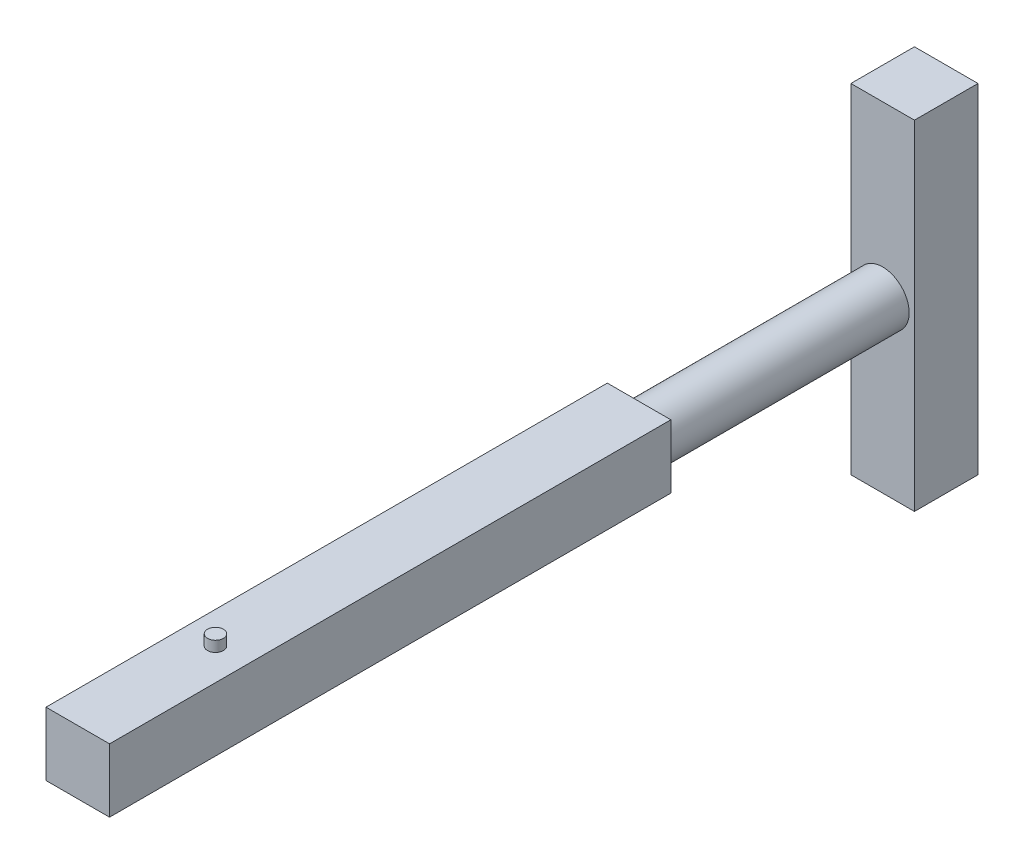
ISO-10303-21;
HEADER;
FILE_DESCRIPTION(('STEP AP214'),'2;1');
FILE_NAME('part.step','',(''),(''),'','','');
FILE_SCHEMA(('AUTOMOTIVE_DESIGN { 1 0 10303 214 1 1 1 1 }'));
ENDSEC;
DATA;
#1=APPLICATION_CONTEXT('core data for automotive mechanical design processes');
#2=APPLICATION_PROTOCOL_DEFINITION('international standard','automotive_design',2000,#1);
#3=PRODUCT_CONTEXT('',#1,'mechanical');
#4=PRODUCT('Part','Part','',(#3));
#5=PRODUCT_RELATED_PRODUCT_CATEGORY('part','',(#4));
#6=PRODUCT_DEFINITION_FORMATION('','',#4);
#7=PRODUCT_DEFINITION_CONTEXT('part definition',#1,'design');
#8=PRODUCT_DEFINITION('design','',#6,#7);
#9=PRODUCT_DEFINITION_SHAPE('','',#8);
#10=(LENGTH_UNIT() NAMED_UNIT(*) SI_UNIT(.MILLI.,.METRE.));
#11=(NAMED_UNIT(*) PLANE_ANGLE_UNIT() SI_UNIT($,.RADIAN.));
#12=(NAMED_UNIT(*) SI_UNIT($,.STERADIAN.) SOLID_ANGLE_UNIT());
#13=UNCERTAINTY_MEASURE_WITH_UNIT(LENGTH_MEASURE(1.E-05),#10,'distance_accuracy_value','');
#14=(GEOMETRIC_REPRESENTATION_CONTEXT(3) GLOBAL_UNCERTAINTY_ASSIGNED_CONTEXT((#13)) GLOBAL_UNIT_ASSIGNED_CONTEXT((#10,
#11,#12)) REPRESENTATION_CONTEXT('',''));
#15=CARTESIAN_POINT('',(0.,0.,0.));
#16=DIRECTION('',(0.,0.,1.));
#17=DIRECTION('',(1.,0.,0.));
#18=AXIS2_PLACEMENT_3D('',#15,#16,#17);
#19=CARTESIAN_POINT('',(30.,30.,530.));
#20=DIRECTION('',(-1.,0.,0.));
#21=DIRECTION('',(0.,-1.,0.));
#22=AXIS2_PLACEMENT_3D('',#19,#20,#21);
#23=PLANE('',#22);
#24=DIRECTION('',(0.,1.,0.));
#25=VECTOR('',#24,1.);
#26=CARTESIAN_POINT('',(30.,30.,0.));
#27=LINE('',#26,#25);
#28=CARTESIAN_POINT('',(30.,-30.,0.));
#29=VERTEX_POINT('',#28);
#30=CARTESIAN_POINT('',(30.,30.,0.));
#31=VERTEX_POINT('',#30);
#32=EDGE_CURVE('E153',#29,#31,#27,.T.);
#33=ORIENTED_EDGE('',*,*,#32,.T.);
#34=DIRECTION('',(0.,0.,-1.));
#35=VECTOR('',#34,1.);
#36=CARTESIAN_POINT('',(30.,30.,530.));
#37=LINE('',#36,#35);
#38=CARTESIAN_POINT('',(30.,30.,530.));
#39=VERTEX_POINT('',#38);
#40=EDGE_CURVE('E157',#39,#31,#37,.T.);
#41=ORIENTED_EDGE('',*,*,#40,.F.);
#42=DIRECTION('',(0.,1.,0.));
#43=VECTOR('',#42,1.);
#44=CARTESIAN_POINT('',(30.,30.,530.));
#45=LINE('',#44,#43);
#46=CARTESIAN_POINT('',(30.,-30.,530.));
#47=VERTEX_POINT('',#46);
#48=EDGE_CURVE('E158',#47,#39,#45,.T.);
#49=ORIENTED_EDGE('',*,*,#48,.F.);
#50=DIRECTION('',(0.,0.,-1.));
#51=VECTOR('',#50,1.);
#52=CARTESIAN_POINT('',(30.,-30.,530.));
#53=LINE('',#52,#51);
#54=EDGE_CURVE('E164',#47,#29,#53,.T.);
#55=ORIENTED_EDGE('',*,*,#54,.T.);
#56=EDGE_LOOP('',(#33,#41,#49,#55));
#57=FACE_BOUND('',#56,.T.);
#58=ADVANCED_FACE('F39',(#57),#23,.F.);
#59=CARTESIAN_POINT('',(-30.,30.,530.));
#60=DIRECTION('',(0.,-1.,0.));
#61=DIRECTION('',(0.,0.,-1.));
#62=AXIS2_PLACEMENT_3D('',#59,#60,#61);
#63=PLANE('',#62);
#64=CARTESIAN_POINT('',(0.,30.,400.));
#65=DIRECTION('',(0.,-1.,0.));
#66=DIRECTION('',(0.,0.,-1.));
#67=AXIS2_PLACEMENT_3D('',#64,#65,#66);
#68=CIRCLE('',#67,7.5);
#69=CARTESIAN_POINT('',(0.,30.,392.5));
#70=VERTEX_POINT('',#69);
#71=EDGE_CURVE('E47',#70,#70,#68,.F.);
#72=ORIENTED_EDGE('',*,*,#71,.F.);
#73=EDGE_LOOP('',(#72));
#74=FACE_BOUND('',#73,.T.);
#75=DIRECTION('',(-1.,0.,0.));
#76=VECTOR('',#75,1.);
#77=CARTESIAN_POINT('',(-30.,30.,0.));
#78=LINE('',#77,#76);
#79=CARTESIAN_POINT('',(-30.,30.,0.));
#80=VERTEX_POINT('',#79);
#81=EDGE_CURVE('E167',#31,#80,#78,.T.);
#82=ORIENTED_EDGE('',*,*,#81,.T.);
#83=DIRECTION('',(0.,0.,-1.));
#84=VECTOR('',#83,1.);
#85=CARTESIAN_POINT('',(-30.,30.,530.));
#86=LINE('',#85,#84);
#87=CARTESIAN_POINT('',(-30.,30.,530.));
#88=VERTEX_POINT('',#87);
#89=EDGE_CURVE('E174',#88,#80,#86,.T.);
#90=ORIENTED_EDGE('',*,*,#89,.F.);
#91=DIRECTION('',(-1.,0.,0.));
#92=VECTOR('',#91,1.);
#93=CARTESIAN_POINT('',(-30.,30.,530.));
#94=LINE('',#93,#92);
#95=EDGE_CURVE('E87',#39,#88,#94,.T.);
#96=ORIENTED_EDGE('',*,*,#95,.F.);
#97=ORIENTED_EDGE('',*,*,#40,.T.);
#98=EDGE_LOOP('',(#82,#90,#96,#97));
#99=FACE_BOUND('',#98,.T.);
#100=ADVANCED_FACE('F181',(#74,#99),#63,.F.);
#101=CARTESIAN_POINT('',(-30.,30.,530.));
#102=DIRECTION('',(1.,0.,0.));
#103=DIRECTION('',(0.,1.,0.));
#104=AXIS2_PLACEMENT_3D('',#101,#102,#103);
#105=PLANE('',#104);
#106=DIRECTION('',(0.,-1.,0.));
#107=VECTOR('',#106,1.);
#108=CARTESIAN_POINT('',(-30.,30.,0.));
#109=LINE('',#108,#107);
#110=CARTESIAN_POINT('',(-30.,-30.,0.));
#111=VERTEX_POINT('',#110);
#112=EDGE_CURVE('E73',#80,#111,#109,.T.);
#113=ORIENTED_EDGE('',*,*,#112,.T.);
#114=DIRECTION('',(0.,0.,-1.));
#115=VECTOR('',#114,1.);
#116=CARTESIAN_POINT('',(-30.,-30.,530.));
#117=LINE('',#116,#115);
#118=CARTESIAN_POINT('',(-30.,-30.,530.));
#119=VERTEX_POINT('',#118);
#120=EDGE_CURVE('E172',#119,#111,#117,.T.);
#121=ORIENTED_EDGE('',*,*,#120,.F.);
#122=DIRECTION('',(0.,-1.,0.));
#123=VECTOR('',#122,1.);
#124=CARTESIAN_POINT('',(-30.,30.,530.));
#125=LINE('',#124,#123);
#126=EDGE_CURVE('E161',#88,#119,#125,.T.);
#127=ORIENTED_EDGE('',*,*,#126,.F.);
#128=ORIENTED_EDGE('',*,*,#89,.T.);
#129=EDGE_LOOP('',(#113,#121,#127,#128));
#130=FACE_BOUND('',#129,.T.);
#131=ADVANCED_FACE('F183',(#130),#105,.F.);
#132=CARTESIAN_POINT('',(-30.,-30.,530.));
#133=DIRECTION('',(0.,1.,0.));
#134=DIRECTION('',(0.,0.,1.));
#135=AXIS2_PLACEMENT_3D('',#132,#133,#134);
#136=PLANE('',#135);
#137=CARTESIAN_POINT('',(0.,-30.,400.));
#138=DIRECTION('',(0.,1.,0.));
#139=DIRECTION('',(0.,0.,1.));
#140=AXIS2_PLACEMENT_3D('',#137,#138,#139);
#141=CIRCLE('',#140,7.5);
#142=CARTESIAN_POINT('',(0.,-30.,407.5));
#143=VERTEX_POINT('',#142);
#144=EDGE_CURVE('E11',#143,#143,#141,.F.);
#145=ORIENTED_EDGE('',*,*,#144,.F.);
#146=EDGE_LOOP('',(#145));
#147=FACE_BOUND('',#146,.T.);
#148=DIRECTION('',(1.,0.,0.));
#149=VECTOR('',#148,1.);
#150=CARTESIAN_POINT('',(-30.,-30.,0.));
#151=LINE('',#150,#149);
#152=EDGE_CURVE('E79',#111,#29,#151,.T.);
#153=ORIENTED_EDGE('',*,*,#152,.T.);
#154=ORIENTED_EDGE('',*,*,#54,.F.);
#155=DIRECTION('',(1.,0.,0.));
#156=VECTOR('',#155,1.);
#157=CARTESIAN_POINT('',(-30.,-30.,530.));
#158=LINE('',#157,#156);
#159=EDGE_CURVE('E55',#119,#47,#158,.T.);
#160=ORIENTED_EDGE('',*,*,#159,.F.);
#161=ORIENTED_EDGE('',*,*,#120,.T.);
#162=EDGE_LOOP('',(#153,#154,#160,#161));
#163=FACE_BOUND('',#162,.T.);
#164=ADVANCED_FACE('F191',(#147,#163),#136,.F.);
#165=CARTESIAN_POINT('',(0.,0.,530.));
#166=DIRECTION('',(0.,0.,1.));
#167=DIRECTION('',(1.,0.,0.));
#168=AXIS2_PLACEMENT_3D('',#165,#166,#167);
#169=PLANE('',#168);
#170=ORIENTED_EDGE('',*,*,#48,.T.);
#171=ORIENTED_EDGE('',*,*,#95,.T.);
#172=ORIENTED_EDGE('',*,*,#126,.T.);
#173=ORIENTED_EDGE('',*,*,#159,.T.);
#174=EDGE_LOOP('',(#170,#171,#172,#173));
#175=FACE_BOUND('',#174,.T.);
#176=ADVANCED_FACE('F193',(#175),#169,.T.);
#177=CARTESIAN_POINT('',(0.,0.,0.));
#178=DIRECTION('',(0.,0.,1.));
#179=DIRECTION('',(1.,0.,0.));
#180=AXIS2_PLACEMENT_3D('',#177,#178,#179);
#181=PLANE('',#180);
#182=CARTESIAN_POINT('',(0.,0.,0.));
#183=DIRECTION('',(0.,0.,-1.));
#184=DIRECTION('',(-1.,0.,0.));
#185=AXIS2_PLACEMENT_3D('',#182,#183,#184);
#186=CIRCLE('',#185,25.);
#187=CARTESIAN_POINT('',(-25.,0.,0.));
#188=VERTEX_POINT('',#187);
#189=EDGE_CURVE('E154',#188,#188,#186,.T.);
#190=ORIENTED_EDGE('',*,*,#189,.F.);
#191=EDGE_LOOP('',(#190));
#192=FACE_BOUND('',#191,.T.);
#193=ORIENTED_EDGE('',*,*,#32,.F.);
#194=ORIENTED_EDGE('',*,*,#152,.F.);
#195=ORIENTED_EDGE('',*,*,#112,.F.);
#196=ORIENTED_EDGE('',*,*,#81,.F.);
#197=EDGE_LOOP('',(#193,#194,#195,#196));
#198=FACE_BOUND('',#197,.T.);
#199=ADVANCED_FACE('F188',(#192,#198),#181,.F.);
#200=CARTESIAN_POINT('',(0.,0.,-230.));
#201=DIRECTION('',(0.,0.,1.));
#202=DIRECTION('',(1.,0.,0.));
#203=AXIS2_PLACEMENT_3D('',#200,#201,#202);
#204=CYLINDRICAL_SURFACE('',#203,25.);
#205=CARTESIAN_POINT('',(0.,0.,-230.));
#206=DIRECTION('',(0.,0.,-1.));
#207=DIRECTION('',(-1.,0.,0.));
#208=AXIS2_PLACEMENT_3D('',#205,#206,#207);
#209=CIRCLE('',#208,25.);
#210=CARTESIAN_POINT('',(-25.,0.,-230.));
#211=VERTEX_POINT('',#210);
#212=EDGE_CURVE('E150',#211,#211,#209,.T.);
#213=ORIENTED_EDGE('',*,*,#212,.F.);
#214=EDGE_LOOP('',(#213));
#215=FACE_BOUND('',#214,.T.);
#216=ORIENTED_EDGE('',*,*,#189,.T.);
#217=EDGE_LOOP('',(#216));
#218=FACE_BOUND('',#217,.T.);
#219=ADVANCED_FACE('F234',(#215,#218),#204,.T.);
#220=CARTESIAN_POINT('',(0.,40.,400.));
#221=DIRECTION('',(0.,-1.,0.));
#222=DIRECTION('',(0.,0.,-1.));
#223=AXIS2_PLACEMENT_3D('',#220,#221,#222);
#224=CYLINDRICAL_SURFACE('',#223,7.5);
#225=CARTESIAN_POINT('',(0.,40.,400.));
#226=DIRECTION('',(0.,1.,0.));
#227=DIRECTION('',(0.,0.,1.));
#228=AXIS2_PLACEMENT_3D('',#225,#226,#227);
#229=CIRCLE('',#228,7.5);
#230=CARTESIAN_POINT('',(0.,40.,407.5));
#231=VERTEX_POINT('',#230);
#232=EDGE_CURVE('E142',#231,#231,#229,.T.);
#233=ORIENTED_EDGE('',*,*,#232,.F.);
#234=EDGE_LOOP('',(#233));
#235=FACE_BOUND('',#234,.T.);
#236=ORIENTED_EDGE('',*,*,#71,.T.);
#237=EDGE_LOOP('',(#236));
#238=FACE_BOUND('',#237,.T.);
#239=ADVANCED_FACE('F179',(#235,#238),#224,.T.);
#240=CARTESIAN_POINT('',(0.,40.,400.));
#241=DIRECTION('',(0.,1.,0.));
#242=DIRECTION('',(0.,0.,1.));
#243=AXIS2_PLACEMENT_3D('',#240,#241,#242);
#244=PLANE('',#243);
#245=ORIENTED_EDGE('',*,*,#232,.T.);
#246=EDGE_LOOP('',(#245));
#247=FACE_BOUND('',#246,.T.);
#248=ADVANCED_FACE('F253',(#247),#244,.T.);
#249=CARTESIAN_POINT('',(0.,-40.,400.));
#250=DIRECTION('',(0.,1.,0.));
#251=DIRECTION('',(0.,0.,1.));
#252=AXIS2_PLACEMENT_3D('',#249,#250,#251);
#253=CYLINDRICAL_SURFACE('',#252,7.5);
#254=CARTESIAN_POINT('',(0.,-40.,400.));
#255=DIRECTION('',(0.,-1.,0.));
#256=DIRECTION('',(0.,0.,-1.));
#257=AXIS2_PLACEMENT_3D('',#254,#255,#256);
#258=CIRCLE('',#257,7.5);
#259=CARTESIAN_POINT('',(0.,-40.,392.5));
#260=VERTEX_POINT('',#259);
#261=EDGE_CURVE('E139',#260,#260,#258,.T.);
#262=ORIENTED_EDGE('',*,*,#261,.F.);
#263=EDGE_LOOP('',(#262));
#264=FACE_BOUND('',#263,.T.);
#265=ORIENTED_EDGE('',*,*,#144,.T.);
#266=EDGE_LOOP('',(#265));
#267=FACE_BOUND('',#266,.T.);
#268=ADVANCED_FACE('F260',(#264,#267),#253,.T.);
#269=CARTESIAN_POINT('',(0.,-40.,400.));
#270=DIRECTION('',(0.,-1.,0.));
#271=DIRECTION('',(0.,0.,-1.));
#272=AXIS2_PLACEMENT_3D('',#269,#270,#271);
#273=PLANE('',#272);
#274=ORIENTED_EDGE('',*,*,#261,.T.);
#275=EDGE_LOOP('',(#274));
#276=FACE_BOUND('',#275,.T.);
#277=ADVANCED_FACE('F268',(#276),#273,.T.);
#278=CARTESIAN_POINT('',(30.0000000000006,160.,-290.));
#279=DIRECTION('',(0.,-1.,0.));
#280=DIRECTION('',(1.,0.,0.));
#281=AXIS2_PLACEMENT_3D('',#278,#279,#280);
#282=PLANE('',#281);
#283=DIRECTION('',(1.,0.,0.));
#284=VECTOR('',#283,1.);
#285=CARTESIAN_POINT('',(30.0000000000006,160.,-230.));
#286=LINE('',#285,#284);
#287=CARTESIAN_POINT('',(-29.9999999999994,160.,-230.));
#288=VERTEX_POINT('',#287);
#289=CARTESIAN_POINT('',(30.0000000000006,160.,-230.));
#290=VERTEX_POINT('',#289);
#291=EDGE_CURVE('E138',#288,#290,#286,.T.);
#292=ORIENTED_EDGE('',*,*,#291,.T.);
#293=DIRECTION('',(0.,0.,1.));
#294=VECTOR('',#293,1.);
#295=CARTESIAN_POINT('',(30.0000000000006,160.,-290.));
#296=LINE('',#295,#294);
#297=CARTESIAN_POINT('',(30.0000000000006,160.,-290.));
#298=VERTEX_POINT('',#297);
#299=EDGE_CURVE('E118',#298,#290,#296,.T.);
#300=ORIENTED_EDGE('',*,*,#299,.F.);
#301=DIRECTION('',(1.,0.,0.));
#302=VECTOR('',#301,1.);
#303=CARTESIAN_POINT('',(30.0000000000006,160.,-290.));
#304=LINE('',#303,#302);
#305=CARTESIAN_POINT('',(-29.9999999999994,160.,-290.));
#306=VERTEX_POINT('',#305);
#307=EDGE_CURVE('E125',#306,#298,#304,.T.);
#308=ORIENTED_EDGE('',*,*,#307,.F.);
#309=DIRECTION('',(0.,0.,1.));
#310=VECTOR('',#309,1.);
#311=CARTESIAN_POINT('',(-29.9999999999994,160.,-290.));
#312=LINE('',#311,#310);
#313=EDGE_CURVE('E414',#306,#288,#312,.T.);
#314=ORIENTED_EDGE('',*,*,#313,.T.);
#315=EDGE_LOOP('',(#292,#300,#308,#314));
#316=FACE_BOUND('',#315,.T.);
#317=ADVANCED_FACE('F136',(#316),#282,.F.);
#318=CARTESIAN_POINT('',(29.9999999999994,-160.,-290.));
#319=DIRECTION('',(-1.,0.,0.));
#320=DIRECTION('',(0.,-1.,0.));
#321=AXIS2_PLACEMENT_3D('',#318,#319,#320);
#322=PLANE('',#321);
#323=DIRECTION('',(0.,-1.,0.));
#324=VECTOR('',#323,1.);
#325=CARTESIAN_POINT('',(29.9999999999994,-160.,-230.));
#326=LINE('',#325,#324);
#327=CARTESIAN_POINT('',(29.9999999999994,-160.,-230.));
#328=VERTEX_POINT('',#327);
#329=EDGE_CURVE('E408',#290,#328,#326,.T.);
#330=ORIENTED_EDGE('',*,*,#329,.T.);
#331=DIRECTION('',(0.,0.,1.));
#332=VECTOR('',#331,1.);
#333=CARTESIAN_POINT('',(29.9999999999994,-160.,-290.));
#334=LINE('',#333,#332);
#335=CARTESIAN_POINT('',(29.9999999999994,-160.,-290.));
#336=VERTEX_POINT('',#335);
#337=EDGE_CURVE('E121',#336,#328,#334,.T.);
#338=ORIENTED_EDGE('',*,*,#337,.F.);
#339=DIRECTION('',(0.,-1.,0.));
#340=VECTOR('',#339,1.);
#341=CARTESIAN_POINT('',(29.9999999999994,-160.,-290.));
#342=LINE('',#341,#340);
#343=EDGE_CURVE('E114',#298,#336,#342,.T.);
#344=ORIENTED_EDGE('',*,*,#343,.F.);
#345=ORIENTED_EDGE('',*,*,#299,.T.);
#346=EDGE_LOOP('',(#330,#338,#344,#345));
#347=FACE_BOUND('',#346,.T.);
#348=ADVANCED_FACE('F116',(#347),#322,.F.);
#349=CARTESIAN_POINT('',(29.9999999999994,-160.,-290.));
#350=DIRECTION('',(0.,1.,0.));
#351=DIRECTION('',(-1.,0.,0.));
#352=AXIS2_PLACEMENT_3D('',#349,#350,#351);
#353=PLANE('',#352);
#354=DIRECTION('',(-1.,0.,0.));
#355=VECTOR('',#354,1.);
#356=CARTESIAN_POINT('',(29.9999999999994,-160.,-230.));
#357=LINE('',#356,#355);
#358=CARTESIAN_POINT('',(-30.0000000000006,-160.,-230.));
#359=VERTEX_POINT('',#358);
#360=EDGE_CURVE('E417',#328,#359,#357,.T.);
#361=ORIENTED_EDGE('',*,*,#360,.T.);
#362=DIRECTION('',(0.,0.,1.));
#363=VECTOR('',#362,1.);
#364=CARTESIAN_POINT('',(-30.0000000000006,-160.,-290.));
#365=LINE('',#364,#363);
#366=CARTESIAN_POINT('',(-30.0000000000006,-160.,-290.));
#367=VERTEX_POINT('',#366);
#368=EDGE_CURVE('E144',#367,#359,#365,.T.);
#369=ORIENTED_EDGE('',*,*,#368,.F.);
#370=DIRECTION('',(-1.,0.,0.));
#371=VECTOR('',#370,1.);
#372=CARTESIAN_POINT('',(29.9999999999994,-160.,-290.));
#373=LINE('',#372,#371);
#374=EDGE_CURVE('E124',#336,#367,#373,.T.);
#375=ORIENTED_EDGE('',*,*,#374,.F.);
#376=ORIENTED_EDGE('',*,*,#337,.T.);
#377=EDGE_LOOP('',(#361,#369,#375,#376));
#378=FACE_BOUND('',#377,.T.);
#379=ADVANCED_FACE('F289',(#378),#353,.F.);
#380=CARTESIAN_POINT('',(-30.0000000000006,-160.,-290.));
#381=DIRECTION('',(1.,0.,0.));
#382=DIRECTION('',(0.,1.,0.));
#383=AXIS2_PLACEMENT_3D('',#380,#381,#382);
#384=PLANE('',#383);
#385=DIRECTION('',(0.,1.,0.));
#386=VECTOR('',#385,1.);
#387=CARTESIAN_POINT('',(-30.0000000000006,-160.,-230.));
#388=LINE('',#387,#386);
#389=EDGE_CURVE('E134',#359,#288,#388,.T.);
#390=ORIENTED_EDGE('',*,*,#389,.T.);
#391=ORIENTED_EDGE('',*,*,#313,.F.);
#392=DIRECTION('',(0.,1.,0.));
#393=VECTOR('',#392,1.);
#394=CARTESIAN_POINT('',(-30.0000000000006,-160.,-290.));
#395=LINE('',#394,#393);
#396=EDGE_CURVE('E130',#367,#306,#395,.T.);
#397=ORIENTED_EDGE('',*,*,#396,.F.);
#398=ORIENTED_EDGE('',*,*,#368,.T.);
#399=EDGE_LOOP('',(#390,#391,#397,#398));
#400=FACE_BOUND('',#399,.T.);
#401=ADVANCED_FACE('F296',(#400),#384,.F.);
#402=CARTESIAN_POINT('',(0.,0.,-290.));
#403=DIRECTION('',(0.,0.,-1.));
#404=DIRECTION('',(-1.,0.,0.));
#405=AXIS2_PLACEMENT_3D('',#402,#403,#404);
#406=PLANE('',#405);
#407=CARTESIAN_POINT('',(0.,0.,-290.));
#408=DIRECTION('',(0.,0.,-1.));
#409=DIRECTION('',(-1.,0.,0.));
#410=AXIS2_PLACEMENT_3D('',#407,#408,#409);
#411=CIRCLE('',#410,7.5);
#412=CARTESIAN_POINT('',(-7.5,0.,-290.));
#413=VERTEX_POINT('',#412);
#414=EDGE_CURVE('E406',#413,#413,#411,.T.);
#415=ORIENTED_EDGE('',*,*,#414,.F.);
#416=EDGE_LOOP('',(#415));
#417=FACE_BOUND('',#416,.T.);
#418=ORIENTED_EDGE('',*,*,#307,.T.);
#419=ORIENTED_EDGE('',*,*,#343,.T.);
#420=ORIENTED_EDGE('',*,*,#374,.T.);
#421=ORIENTED_EDGE('',*,*,#396,.T.);
#422=EDGE_LOOP('',(#418,#419,#420,#421));
#423=FACE_BOUND('',#422,.T.);
#424=ADVANCED_FACE('F128',(#417,#423),#406,.T.);
#425=CARTESIAN_POINT('',(0.,0.,-230.));
#426=DIRECTION('',(0.,0.,-1.));
#427=DIRECTION('',(-1.,0.,0.));
#428=AXIS2_PLACEMENT_3D('',#425,#426,#427);
#429=PLANE('',#428);
#430=ORIENTED_EDGE('',*,*,#212,.T.);
#431=EDGE_LOOP('',(#430));
#432=FACE_BOUND('',#431,.T.);
#433=ORIENTED_EDGE('',*,*,#291,.F.);
#434=ORIENTED_EDGE('',*,*,#389,.F.);
#435=ORIENTED_EDGE('',*,*,#360,.F.);
#436=ORIENTED_EDGE('',*,*,#329,.F.);
#437=EDGE_LOOP('',(#433,#434,#435,#436));
#438=FACE_BOUND('',#437,.T.);
#439=ADVANCED_FACE('F312',(#432,#438),#429,.F.);
#440=CARTESIAN_POINT('',(0.,0.,-250.));
#441=DIRECTION('',(0.,0.,-1.));
#442=DIRECTION('',(-1.,0.,0.));
#443=AXIS2_PLACEMENT_3D('',#440,#441,#442);
#444=CYLINDRICAL_SURFACE('',#443,7.5);
#445=CARTESIAN_POINT('',(0.,0.,-250.));
#446=DIRECTION('',(0.,0.,-1.));
#447=DIRECTION('',(-1.,0.,0.));
#448=AXIS2_PLACEMENT_3D('',#445,#446,#447);
#449=CIRCLE('',#448,7.5);
#450=CARTESIAN_POINT('',(-7.5,0.,-250.));
#451=VERTEX_POINT('',#450);
#452=EDGE_CURVE('E405',#451,#451,#449,.T.);
#453=ORIENTED_EDGE('',*,*,#452,.F.);
#454=EDGE_LOOP('',(#453));
#455=FACE_BOUND('',#454,.T.);
#456=ORIENTED_EDGE('',*,*,#414,.T.);
#457=EDGE_LOOP('',(#456));
#458=FACE_BOUND('',#457,.T.);
#459=ADVANCED_FACE('F320',(#455,#458),#444,.F.);
#460=CARTESIAN_POINT('',(0.,0.,-250.));
#461=DIRECTION('',(0.,0.,-1.));
#462=DIRECTION('',(-1.,0.,0.));
#463=AXIS2_PLACEMENT_3D('',#460,#461,#462);
#464=PLANE('',#463);
#465=ORIENTED_EDGE('',*,*,#452,.T.);
#466=EDGE_LOOP('',(#465));
#467=FACE_BOUND('',#466,.T.);
#468=ADVANCED_FACE('F327',(#467),#464,.T.);
#469=CLOSED_SHELL('',(#58,#100,#131,#164,#176,#199,#219,#239,#248,#268,#277,#317,#348,#379,#401,
#424,#439,#459,#468));
#470=MANIFOLD_SOLID_BREP('B2',#469);
#471=ADVANCED_BREP_SHAPE_REPRESENTATION('',(#18,#470),#14);
#472=SHAPE_DEFINITION_REPRESENTATION(#9,#471);
ENDSEC;
END-ISO-10303-21;
